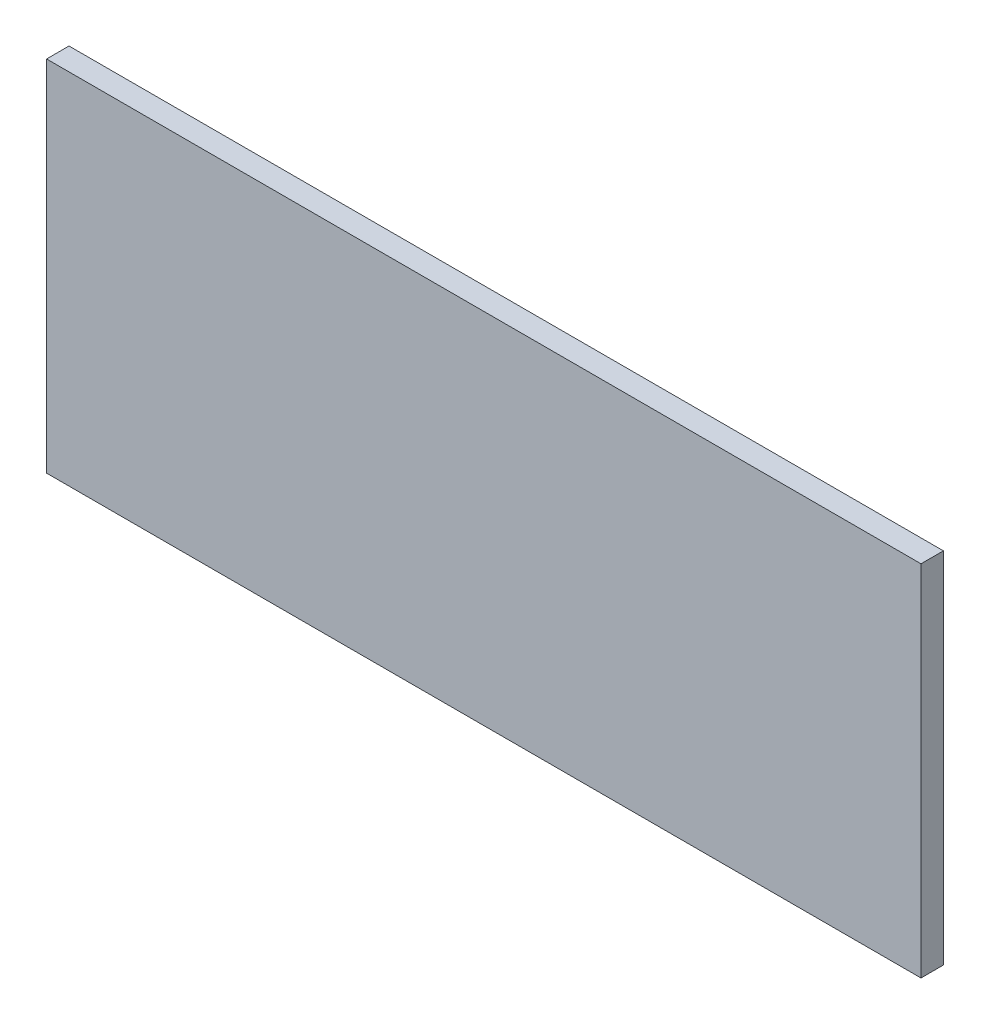
ISO-10303-21;
HEADER;
FILE_DESCRIPTION(('STEP AP214'),'2;1');
FILE_NAME('part.step','',(''),(''),'','','');
FILE_SCHEMA(('AUTOMOTIVE_DESIGN { 1 0 10303 214 1 1 1 1 }'));
ENDSEC;
DATA;
#1=APPLICATION_CONTEXT('core data for automotive mechanical design processes');
#2=APPLICATION_PROTOCOL_DEFINITION('international standard','automotive_design',2000,#1);
#3=PRODUCT_CONTEXT('',#1,'mechanical');
#4=PRODUCT('Part','Part','',(#3));
#5=PRODUCT_RELATED_PRODUCT_CATEGORY('part','',(#4));
#6=PRODUCT_DEFINITION_FORMATION('','',#4);
#7=PRODUCT_DEFINITION_CONTEXT('part definition',#1,'design');
#8=PRODUCT_DEFINITION('design','',#6,#7);
#9=PRODUCT_DEFINITION_SHAPE('','',#8);
#10=(LENGTH_UNIT() NAMED_UNIT(*) SI_UNIT(.MILLI.,.METRE.));
#11=(NAMED_UNIT(*) PLANE_ANGLE_UNIT() SI_UNIT($,.RADIAN.));
#12=(NAMED_UNIT(*) SI_UNIT($,.STERADIAN.) SOLID_ANGLE_UNIT());
#13=UNCERTAINTY_MEASURE_WITH_UNIT(LENGTH_MEASURE(1.E-05),#10,'distance_accuracy_value','');
#14=(GEOMETRIC_REPRESENTATION_CONTEXT(3) GLOBAL_UNCERTAINTY_ASSIGNED_CONTEXT((#13)) GLOBAL_UNIT_ASSIGNED_CONTEXT((#10,
#11,#12)) REPRESENTATION_CONTEXT('',''));
#15=CARTESIAN_POINT('',(0.,0.,0.));
#16=DIRECTION('',(0.,0.,1.));
#17=DIRECTION('',(1.,0.,0.));
#18=AXIS2_PLACEMENT_3D('',#15,#16,#17);
#19=CARTESIAN_POINT('',(19.5,-8.,1.));
#20=DIRECTION('',(-1.,0.,0.));
#21=DIRECTION('',(0.,0.,1.));
#22=AXIS2_PLACEMENT_3D('',#19,#20,#21);
#23=PLANE('',#22);
#24=DIRECTION('',(0.,1.,0.));
#25=VECTOR('',#24,1.);
#26=CARTESIAN_POINT('',(19.5,-8.,0.));
#27=LINE('',#26,#25);
#28=CARTESIAN_POINT('',(19.5,-8.,0.));
#29=VERTEX_POINT('',#28);
#30=CARTESIAN_POINT('',(19.5,8.,0.));
#31=VERTEX_POINT('',#30);
#32=EDGE_CURVE('E100',#29,#31,#27,.T.);
#33=ORIENTED_EDGE('',*,*,#32,.T.);
#34=DIRECTION('',(0.,0.,-1.));
#35=VECTOR('',#34,1.);
#36=CARTESIAN_POINT('',(19.5,8.,1.));
#37=LINE('',#36,#35);
#38=CARTESIAN_POINT('',(19.5,8.,1.));
#39=VERTEX_POINT('',#38);
#40=EDGE_CURVE('E11',#39,#31,#37,.T.);
#41=ORIENTED_EDGE('',*,*,#40,.F.);
#42=DIRECTION('',(0.,1.,0.));
#43=VECTOR('',#42,1.);
#44=CARTESIAN_POINT('',(19.5,-8.,1.));
#45=LINE('',#44,#43);
#46=CARTESIAN_POINT('',(19.5,-8.,1.));
#47=VERTEX_POINT('',#46);
#48=EDGE_CURVE('E88',#47,#39,#45,.T.);
#49=ORIENTED_EDGE('',*,*,#48,.F.);
#50=DIRECTION('',(0.,0.,-1.));
#51=VECTOR('',#50,1.);
#52=CARTESIAN_POINT('',(19.5,-8.,1.));
#53=LINE('',#52,#51);
#54=EDGE_CURVE('E96',#47,#29,#53,.T.);
#55=ORIENTED_EDGE('',*,*,#54,.T.);
#56=EDGE_LOOP('',(#33,#41,#49,#55));
#57=FACE_BOUND('',#56,.T.);
#58=ADVANCED_FACE('F37',(#57),#23,.F.);
#59=CARTESIAN_POINT('',(-19.5,8.,1.));
#60=DIRECTION('',(0.,-1.,0.));
#61=DIRECTION('',(0.,0.,-1.));
#62=AXIS2_PLACEMENT_3D('',#59,#60,#61);
#63=PLANE('',#62);
#64=DIRECTION('',(-1.,0.,0.));
#65=VECTOR('',#64,1.);
#66=CARTESIAN_POINT('',(-19.5,8.,0.));
#67=LINE('',#66,#65);
#68=CARTESIAN_POINT('',(-19.5,8.,0.));
#69=VERTEX_POINT('',#68);
#70=EDGE_CURVE('E92',#31,#69,#67,.T.);
#71=ORIENTED_EDGE('',*,*,#70,.T.);
#72=DIRECTION('',(0.,0.,-1.));
#73=VECTOR('',#72,1.);
#74=CARTESIAN_POINT('',(-19.5,8.,1.));
#75=LINE('',#74,#73);
#76=CARTESIAN_POINT('',(-19.5,8.,1.));
#77=VERTEX_POINT('',#76);
#78=EDGE_CURVE('E45',#77,#69,#75,.T.);
#79=ORIENTED_EDGE('',*,*,#78,.F.);
#80=DIRECTION('',(-1.,0.,0.));
#81=VECTOR('',#80,1.);
#82=CARTESIAN_POINT('',(-19.5,8.,1.));
#83=LINE('',#82,#81);
#84=EDGE_CURVE('E83',#39,#77,#83,.T.);
#85=ORIENTED_EDGE('',*,*,#84,.F.);
#86=ORIENTED_EDGE('',*,*,#40,.T.);
#87=EDGE_LOOP('',(#71,#79,#85,#86));
#88=FACE_BOUND('',#87,.T.);
#89=ADVANCED_FACE('F91',(#88),#63,.F.);
#90=CARTESIAN_POINT('',(-19.5,-8.,1.));
#91=DIRECTION('',(1.,0.,0.));
#92=DIRECTION('',(0.,0.,-1.));
#93=AXIS2_PLACEMENT_3D('',#90,#91,#92);
#94=PLANE('',#93);
#95=DIRECTION('',(0.,-1.,0.));
#96=VECTOR('',#95,1.);
#97=CARTESIAN_POINT('',(-19.5,-8.,0.));
#98=LINE('',#97,#96);
#99=CARTESIAN_POINT('',(-19.5,-8.,0.));
#100=VERTEX_POINT('',#99);
#101=EDGE_CURVE('E70',#69,#100,#98,.T.);
#102=ORIENTED_EDGE('',*,*,#101,.T.);
#103=DIRECTION('',(0.,0.,-1.));
#104=VECTOR('',#103,1.);
#105=CARTESIAN_POINT('',(-19.5,-8.,1.));
#106=LINE('',#105,#104);
#107=CARTESIAN_POINT('',(-19.5,-8.,1.));
#108=VERTEX_POINT('',#107);
#109=EDGE_CURVE('E93',#108,#100,#106,.T.);
#110=ORIENTED_EDGE('',*,*,#109,.F.);
#111=DIRECTION('',(0.,-1.,0.));
#112=VECTOR('',#111,1.);
#113=CARTESIAN_POINT('',(-19.5,-8.,1.));
#114=LINE('',#113,#112);
#115=EDGE_CURVE('E86',#77,#108,#114,.T.);
#116=ORIENTED_EDGE('',*,*,#115,.F.);
#117=ORIENTED_EDGE('',*,*,#78,.T.);
#118=EDGE_LOOP('',(#102,#110,#116,#117));
#119=FACE_BOUND('',#118,.T.);
#120=ADVANCED_FACE('F94',(#119),#94,.F.);
#121=CARTESIAN_POINT('',(-19.5,-8.,1.));
#122=DIRECTION('',(0.,1.,0.));
#123=DIRECTION('',(0.,0.,1.));
#124=AXIS2_PLACEMENT_3D('',#121,#122,#123);
#125=PLANE('',#124);
#126=DIRECTION('',(1.,0.,0.));
#127=VECTOR('',#126,1.);
#128=CARTESIAN_POINT('',(-19.5,-8.,0.));
#129=LINE('',#128,#127);
#130=EDGE_CURVE('E76',#100,#29,#129,.T.);
#131=ORIENTED_EDGE('',*,*,#130,.T.);
#132=ORIENTED_EDGE('',*,*,#54,.F.);
#133=DIRECTION('',(1.,0.,0.));
#134=VECTOR('',#133,1.);
#135=CARTESIAN_POINT('',(-19.5,-8.,1.));
#136=LINE('',#135,#134);
#137=EDGE_CURVE('E53',#108,#47,#136,.T.);
#138=ORIENTED_EDGE('',*,*,#137,.F.);
#139=ORIENTED_EDGE('',*,*,#109,.T.);
#140=EDGE_LOOP('',(#131,#132,#138,#139));
#141=FACE_BOUND('',#140,.T.);
#142=ADVANCED_FACE('F107',(#141),#125,.F.);
#143=CARTESIAN_POINT('',(0.,0.,1.));
#144=DIRECTION('',(0.,0.,-1.));
#145=DIRECTION('',(-1.,0.,0.));
#146=AXIS2_PLACEMENT_3D('',#143,#144,#145);
#147=PLANE('',#146);
#148=ORIENTED_EDGE('',*,*,#48,.T.);
#149=ORIENTED_EDGE('',*,*,#84,.T.);
#150=ORIENTED_EDGE('',*,*,#115,.T.);
#151=ORIENTED_EDGE('',*,*,#137,.T.);
#152=EDGE_LOOP('',(#148,#149,#150,#151));
#153=FACE_BOUND('',#152,.T.);
#154=ADVANCED_FACE('F84',(#153),#147,.F.);
#155=CARTESIAN_POINT('',(0.,0.,0.));
#156=DIRECTION('',(0.,0.,-1.));
#157=DIRECTION('',(-1.,0.,0.));
#158=AXIS2_PLACEMENT_3D('',#155,#156,#157);
#159=PLANE('',#158);
#160=ORIENTED_EDGE('',*,*,#32,.F.);
#161=ORIENTED_EDGE('',*,*,#130,.F.);
#162=ORIENTED_EDGE('',*,*,#101,.F.);
#163=ORIENTED_EDGE('',*,*,#70,.F.);
#164=EDGE_LOOP('',(#160,#161,#162,#163));
#165=FACE_BOUND('',#164,.T.);
#166=ADVANCED_FACE('F110',(#165),#159,.T.);
#167=CLOSED_SHELL('',(#58,#89,#120,#142,#154,#166));
#168=MANIFOLD_SOLID_BREP('B2',#167);
#169=ADVANCED_BREP_SHAPE_REPRESENTATION('',(#18,#168),#14);
#170=SHAPE_DEFINITION_REPRESENTATION(#9,#169);
ENDSEC;
END-ISO-10303-21;
